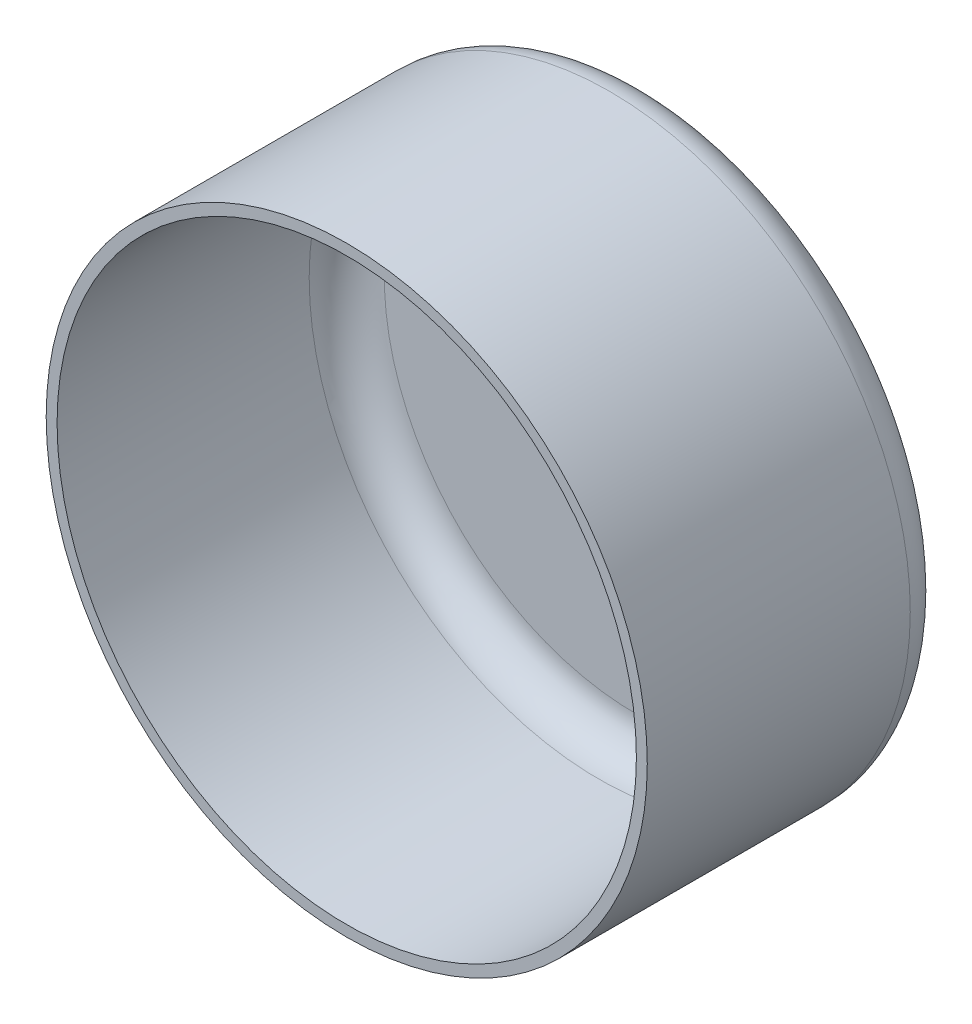
ISO-10303-21;
HEADER;
FILE_DESCRIPTION(('STEP AP214'),'2;1');
FILE_NAME('part.step','',(''),(''),'','','');
FILE_SCHEMA(('AUTOMOTIVE_DESIGN { 1 0 10303 214 1 1 1 1 }'));
ENDSEC;
DATA;
#1=APPLICATION_CONTEXT('core data for automotive mechanical design processes');
#2=APPLICATION_PROTOCOL_DEFINITION('international standard','automotive_design',2000,#1);
#3=PRODUCT_CONTEXT('',#1,'mechanical');
#4=PRODUCT('Part','Part','',(#3));
#5=PRODUCT_RELATED_PRODUCT_CATEGORY('part','',(#4));
#6=PRODUCT_DEFINITION_FORMATION('','',#4);
#7=PRODUCT_DEFINITION_CONTEXT('part definition',#1,'design');
#8=PRODUCT_DEFINITION('design','',#6,#7);
#9=PRODUCT_DEFINITION_SHAPE('','',#8);
#10=(LENGTH_UNIT() NAMED_UNIT(*) SI_UNIT(.MILLI.,.METRE.));
#11=(NAMED_UNIT(*) PLANE_ANGLE_UNIT() SI_UNIT($,.RADIAN.));
#12=(NAMED_UNIT(*) SI_UNIT($,.STERADIAN.) SOLID_ANGLE_UNIT());
#13=UNCERTAINTY_MEASURE_WITH_UNIT(LENGTH_MEASURE(1.E-05),#10,'distance_accuracy_value','');
#14=(GEOMETRIC_REPRESENTATION_CONTEXT(3) GLOBAL_UNCERTAINTY_ASSIGNED_CONTEXT((#13)) GLOBAL_UNIT_ASSIGNED_CONTEXT((#10,
#11,#12)) REPRESENTATION_CONTEXT('',''));
#15=CARTESIAN_POINT('',(0.,0.,0.));
#16=DIRECTION('',(0.,0.,1.));
#17=DIRECTION('',(1.,0.,0.));
#18=AXIS2_PLACEMENT_3D('',#15,#16,#17);
#19=CARTESIAN_POINT('',(0.,0.,40.));
#20=DIRECTION('',(0.,0.,-1.));
#21=DIRECTION('',(-1.,0.,0.));
#22=AXIS2_PLACEMENT_3D('',#19,#20,#21);
#23=CYLINDRICAL_SURFACE('',#22,40.);
#24=CARTESIAN_POINT('',(0.,0.,5.));
#25=DIRECTION('',(0.,0.,1.));
#26=DIRECTION('',(1.,0.,0.));
#27=AXIS2_PLACEMENT_3D('',#24,#25,#26);
#28=CIRCLE('',#27,40.);
#29=CARTESIAN_POINT('',(40.,0.,5.));
#30=VERTEX_POINT('',#29);
#31=EDGE_CURVE('E47',#30,#30,#28,.T.);
#32=ORIENTED_EDGE('',*,*,#31,.T.);
#33=EDGE_LOOP('',(#32));
#34=FACE_BOUND('',#33,.T.);
#35=CARTESIAN_POINT('',(0.,0.,40.));
#36=DIRECTION('',(0.,0.,1.));
#37=DIRECTION('',(1.,0.,0.));
#38=AXIS2_PLACEMENT_3D('',#35,#36,#37);
#39=CIRCLE('',#38,40.);
#40=CARTESIAN_POINT('',(40.,0.,40.));
#41=VERTEX_POINT('',#40);
#42=EDGE_CURVE('E52',#41,#41,#39,.T.);
#43=ORIENTED_EDGE('',*,*,#42,.F.);
#44=EDGE_LOOP('',(#43));
#45=FACE_BOUND('',#44,.T.);
#46=ADVANCED_FACE('F32',(#34,#45),#23,.T.);
#47=CARTESIAN_POINT('',(0.,0.,40.));
#48=DIRECTION('',(0.,0.,1.));
#49=DIRECTION('',(1.,0.,0.));
#50=AXIS2_PLACEMENT_3D('',#47,#48,#49);
#51=PLANE('',#50);
#52=CARTESIAN_POINT('',(0.,0.,40.));
#53=DIRECTION('',(0.,0.,1.));
#54=DIRECTION('',(1.,0.,0.));
#55=AXIS2_PLACEMENT_3D('',#52,#53,#54);
#56=CIRCLE('',#55,38.55);
#57=CARTESIAN_POINT('',(38.55,0.,40.));
#58=VERTEX_POINT('',#57);
#59=EDGE_CURVE('E55',#58,#58,#56,.T.);
#60=ORIENTED_EDGE('',*,*,#59,.F.);
#61=EDGE_LOOP('',(#60));
#62=FACE_BOUND('',#61,.T.);
#63=ORIENTED_EDGE('',*,*,#42,.T.);
#64=EDGE_LOOP('',(#63));
#65=FACE_BOUND('',#64,.T.);
#66=ADVANCED_FACE('F61',(#62,#65),#51,.T.);
#67=CARTESIAN_POINT('',(0.,0.,0.));
#68=DIRECTION('',(0.,0.,1.));
#69=DIRECTION('',(1.,0.,0.));
#70=AXIS2_PLACEMENT_3D('',#67,#68,#69);
#71=PLANE('',#70);
#72=CARTESIAN_POINT('',(0.,0.,0.));
#73=DIRECTION('',(0.,0.,1.));
#74=DIRECTION('',(1.,0.,0.));
#75=AXIS2_PLACEMENT_3D('',#72,#73,#74);
#76=CIRCLE('',#75,35.);
#77=CARTESIAN_POINT('',(35.,0.,0.));
#78=VERTEX_POINT('',#77);
#79=EDGE_CURVE('E43',#78,#78,#76,.F.);
#80=ORIENTED_EDGE('',*,*,#79,.T.);
#81=EDGE_LOOP('',(#80));
#82=FACE_BOUND('',#81,.T.);
#83=ADVANCED_FACE('F64',(#82),#71,.F.);
#84=CARTESIAN_POINT('',(0.,0.,40.));
#85=DIRECTION('',(0.,0.,-1.));
#86=DIRECTION('',(-1.,0.,0.));
#87=AXIS2_PLACEMENT_3D('',#84,#85,#86);
#88=CYLINDRICAL_SURFACE('',#87,38.55);
#89=CARTESIAN_POINT('',(0.,0.,6.45));
#90=DIRECTION('',(0.,0.,1.));
#91=DIRECTION('',(1.,0.,0.));
#92=AXIS2_PLACEMENT_3D('',#89,#90,#91);
#93=CIRCLE('',#92,38.55);
#94=CARTESIAN_POINT('',(38.55,0.,6.45));
#95=VERTEX_POINT('',#94);
#96=EDGE_CURVE('E10',#95,#95,#93,.F.);
#97=ORIENTED_EDGE('',*,*,#96,.T.);
#98=EDGE_LOOP('',(#97));
#99=FACE_BOUND('',#98,.T.);
#100=ORIENTED_EDGE('',*,*,#59,.T.);
#101=EDGE_LOOP('',(#100));
#102=FACE_BOUND('',#101,.T.);
#103=ADVANCED_FACE('F59',(#99,#102),#88,.F.);
#104=CARTESIAN_POINT('',(0.,0.,1.45));
#105=DIRECTION('',(0.,0.,1.));
#106=DIRECTION('',(1.,0.,0.));
#107=AXIS2_PLACEMENT_3D('',#104,#105,#106);
#108=PLANE('',#107);
#109=CARTESIAN_POINT('',(0.,0.,1.45));
#110=DIRECTION('',(0.,0.,1.));
#111=DIRECTION('',(1.,0.,0.));
#112=AXIS2_PLACEMENT_3D('',#109,#110,#111);
#113=CIRCLE('',#112,33.55);
#114=CARTESIAN_POINT('',(33.55,0.,1.45));
#115=VERTEX_POINT('',#114);
#116=EDGE_CURVE('E39',#115,#115,#113,.T.);
#117=ORIENTED_EDGE('',*,*,#116,.T.);
#118=EDGE_LOOP('',(#117));
#119=FACE_BOUND('',#118,.T.);
#120=ADVANCED_FACE('F77',(#119),#108,.T.);
#121=CARTESIAN_POINT('',(0.,0.,5.));
#122=DIRECTION('',(0.,0.,1.));
#123=DIRECTION('',(1.,0.,0.));
#124=AXIS2_PLACEMENT_3D('',#121,#122,#123);
#125=TOROIDAL_SURFACE('',#124,35.,5.);
#126=ORIENTED_EDGE('',*,*,#79,.F.);
#127=EDGE_LOOP('',(#126));
#128=FACE_BOUND('',#127,.T.);
#129=ORIENTED_EDGE('',*,*,#31,.F.);
#130=EDGE_LOOP('',(#129));
#131=FACE_BOUND('',#130,.T.);
#132=ADVANCED_FACE('F75',(#128,#131),#125,.T.);
#133=CARTESIAN_POINT('',(0.,0.,6.45));
#134=DIRECTION('',(0.,0.,1.));
#135=DIRECTION('',(1.,0.,0.));
#136=AXIS2_PLACEMENT_3D('',#133,#134,#135);
#137=TOROIDAL_SURFACE('',#136,33.55,5.);
#138=ORIENTED_EDGE('',*,*,#96,.F.);
#139=EDGE_LOOP('',(#138));
#140=FACE_BOUND('',#139,.T.);
#141=ORIENTED_EDGE('',*,*,#116,.F.);
#142=EDGE_LOOP('',(#141));
#143=FACE_BOUND('',#142,.T.);
#144=ADVANCED_FACE('F34',(#140,#143),#137,.F.);
#145=CLOSED_SHELL('',(#46,#66,#83,#103,#120,#132,#144));
#146=MANIFOLD_SOLID_BREP('B2',#145);
#147=ADVANCED_BREP_SHAPE_REPRESENTATION('',(#18,#146),#14);
#148=SHAPE_DEFINITION_REPRESENTATION(#9,#147);
ENDSEC;
END-ISO-10303-21;
